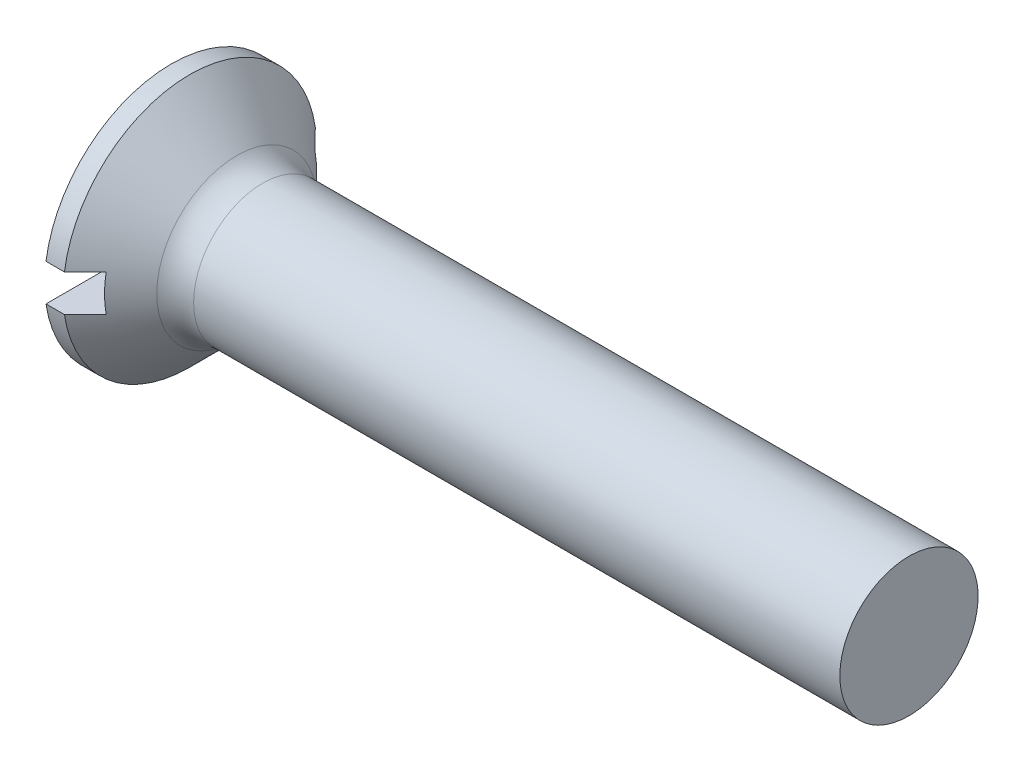
ISO-10303-21;
HEADER;
FILE_DESCRIPTION(('STEP AP214'),'2;1');
FILE_NAME('part.step','',(''),(''),'','','');
FILE_SCHEMA(('AUTOMOTIVE_DESIGN { 1 0 10303 214 1 1 1 1 }'));
ENDSEC;
DATA;
#1=APPLICATION_CONTEXT('core data for automotive mechanical design processes');
#2=APPLICATION_PROTOCOL_DEFINITION('international standard','automotive_design',2000,#1);
#3=PRODUCT_CONTEXT('',#1,'mechanical');
#4=PRODUCT('Part','Part','',(#3));
#5=PRODUCT_RELATED_PRODUCT_CATEGORY('part','',(#4));
#6=PRODUCT_DEFINITION_FORMATION('','',#4);
#7=PRODUCT_DEFINITION_CONTEXT('part definition',#1,'design');
#8=PRODUCT_DEFINITION('design','',#6,#7);
#9=PRODUCT_DEFINITION_SHAPE('','',#8);
#10=(LENGTH_UNIT() NAMED_UNIT(*) SI_UNIT(.MILLI.,.METRE.));
#11=(NAMED_UNIT(*) PLANE_ANGLE_UNIT() SI_UNIT($,.RADIAN.));
#12=(NAMED_UNIT(*) SI_UNIT($,.STERADIAN.) SOLID_ANGLE_UNIT());
#13=UNCERTAINTY_MEASURE_WITH_UNIT(LENGTH_MEASURE(1.E-05),#10,'distance_accuracy_value','');
#14=(GEOMETRIC_REPRESENTATION_CONTEXT(3) GLOBAL_UNCERTAINTY_ASSIGNED_CONTEXT((#13)) GLOBAL_UNIT_ASSIGNED_CONTEXT((#10,
#11,#12)) REPRESENTATION_CONTEXT('',''));
#15=CARTESIAN_POINT('',(0.,0.,0.));
#16=DIRECTION('',(0.,0.,1.));
#17=DIRECTION('',(1.,0.,0.));
#18=AXIS2_PLACEMENT_3D('',#15,#16,#17);
#19=CARTESIAN_POINT('',(0.85,0.4,-2.75));
#20=DIRECTION('',(-1.,0.,0.));
#21=DIRECTION('',(0.,0.,1.));
#22=AXIS2_PLACEMENT_3D('',#19,#20,#21);
#23=PLANE('',#22);
#24=DIRECTION('',(0.,0.,1.));
#25=VECTOR('',#24,1.);
#26=CARTESIAN_POINT('',(0.85,0.4,2.75));
#27=LINE('',#26,#25);
#28=CARTESIAN_POINT('',(0.850000000034848,0.4,2.26495033058316));
#29=VERTEX_POINT('',#28);
#30=CARTESIAN_POINT('',(0.850000000022832,0.4,-2.26495033059536));
#31=VERTEX_POINT('',#30);
#32=EDGE_CURVE('E74',#29,#31,#27,.F.);
#33=ORIENTED_EDGE('',*,*,#32,.T.);
#34=CARTESIAN_POINT('',(0.850000000045666,0.,0.));
#35=DIRECTION('',(-1.,0.,0.));
#36=DIRECTION('',(0.,0.,1.));
#37=AXIS2_PLACEMENT_3D('',#34,#35,#36);
#38=CIRCLE('',#37,2.29999999999109);
#39=CARTESIAN_POINT('',(0.850000000034848,-0.400000000000001,-2.26495033058316));
#40=VERTEX_POINT('',#39);
#41=EDGE_CURVE('E83',#31,#40,#38,.T.);
#42=ORIENTED_EDGE('',*,*,#41,.T.);
#43=DIRECTION('',(0.,0.,-1.));
#44=VECTOR('',#43,1.);
#45=CARTESIAN_POINT('',(0.85,-0.400000000000001,-2.75));
#46=LINE('',#45,#44);
#47=CARTESIAN_POINT('',(0.850000000022832,-0.400000000000001,2.26495033059536));
#48=VERTEX_POINT('',#47);
#49=EDGE_CURVE('E81',#40,#48,#46,.F.);
#50=ORIENTED_EDGE('',*,*,#49,.T.);
#51=CARTESIAN_POINT('',(0.850000000045665,0.,0.));
#52=DIRECTION('',(-1.,0.,0.));
#53=DIRECTION('',(0.,0.,1.));
#54=AXIS2_PLACEMENT_3D('',#51,#52,#53);
#55=CIRCLE('',#54,2.29999999999109);
#56=EDGE_CURVE('E19',#48,#29,#55,.T.);
#57=ORIENTED_EDGE('',*,*,#56,.T.);
#58=EDGE_LOOP('',(#33,#42,#50,#57));
#59=FACE_BOUND('',#58,.T.);
#60=ADVANCED_FACE('F16',(#59),#23,.T.);
#61=CARTESIAN_POINT('',(0.85,-0.400000000000001,-2.75));
#62=DIRECTION('',(0.,-1.,0.));
#63=DIRECTION('',(0.,0.,-1.));
#64=AXIS2_PLACEMENT_3D('',#61,#62,#63);
#65=PLANE('',#64);
#66=CARTESIAN_POINT('',(0.850000000024471,-0.400000000000001,2.2649503305937));
#67=CARTESIAN_POINT('',(0.775087851769284,-0.400000000000001,2.34100427520676));
#68=CARTESIAN_POINT('',(0.700131776523776,-0.400000000000001,2.41701485210356));
#69=CARTESIAN_POINT('',(0.550131776521702,-0.400000000000001,2.56894926593744));
#70=CARTESIAN_POINT('',(0.475087851770372,-0.400000000000001,2.64487310287968));
#71=CARTESIAN_POINT('',(0.400000000033956,-0.400000000000001,2.72075357211084));
#72=B_SPLINE_CURVE_WITH_KNOTS('',3,(#66,#67,#68,#69,#70,#71),.UNSPECIFIED.,.F.,.F.,(4,2,4),(0.,
0.320256442788528,0.64051286649153),.UNSPECIFIED.);
#73=CARTESIAN_POINT('',(0.400000000023617,-0.400000000000001,2.7207535720967));
#74=VERTEX_POINT('',#73);
#75=EDGE_CURVE('E98',#48,#74,#72,.T.);
#76=ORIENTED_EDGE('',*,*,#75,.F.);
#77=ORIENTED_EDGE('',*,*,#49,.F.);
#78=CARTESIAN_POINT('',(0.400000000033956,-0.400000000000001,-2.72075357211084));
#79=CARTESIAN_POINT('',(0.475087851770298,-0.400000000000001,-2.64487310287976));
#80=CARTESIAN_POINT('',(0.550131776521555,-0.400000000000001,-2.56894926593759));
#81=CARTESIAN_POINT('',(0.700131776523482,-0.400000000000001,-2.41701485210386));
#82=CARTESIAN_POINT('',(0.775087851768918,-0.400000000000001,-2.34100427520713));
#83=CARTESIAN_POINT('',(0.850000000024031,-0.400000000000001,-2.26495033059414));
#84=B_SPLINE_CURVE_WITH_KNOTS('',3,(#78,#79,#80,#81,#82,#83),.UNSPECIFIED.,.F.,.F.,(4,2,4),(0.,
0.320256423702689,0.640512866490904),.UNSPECIFIED.);
#85=CARTESIAN_POINT('',(0.400000000037608,-0.400000000000001,-2.72075357207842));
#86=VERTEX_POINT('',#85);
#87=EDGE_CURVE('E99',#86,#40,#84,.T.);
#88=ORIENTED_EDGE('',*,*,#87,.F.);
#89=DIRECTION('',(1.,0.,0.));
#90=VECTOR('',#89,1.);
#91=CARTESIAN_POINT('',(0.85,-0.400000000000001,-2.72075357208256));
#92=LINE('',#91,#90);
#93=CARTESIAN_POINT('',(0.,-0.400000000000001,-2.72075357208256));
#94=VERTEX_POINT('',#93);
#95=EDGE_CURVE('E137',#94,#86,#92,.T.);
#96=ORIENTED_EDGE('',*,*,#95,.F.);
#97=DIRECTION('',(0.,0.,1.));
#98=VECTOR('',#97,1.);
#99=CARTESIAN_POINT('',(0.,-0.400000000000001,0.));
#100=LINE('',#99,#98);
#101=CARTESIAN_POINT('',(0.,-0.400000000000001,2.72075357208256));
#102=VERTEX_POINT('',#101);
#103=EDGE_CURVE('E165',#102,#94,#100,.F.);
#104=ORIENTED_EDGE('',*,*,#103,.F.);
#105=DIRECTION('',(1.,0.,0.));
#106=VECTOR('',#105,1.);
#107=CARTESIAN_POINT('',(0.85,-0.400000000000001,2.72075357208256));
#108=LINE('',#107,#106);
#109=EDGE_CURVE('E170',#74,#102,#108,.F.);
#110=ORIENTED_EDGE('',*,*,#109,.F.);
#111=EDGE_LOOP('',(#76,#77,#88,#96,#104,#110));
#112=FACE_BOUND('',#111,.T.);
#113=ADVANCED_FACE('F138',(#112),#65,.F.);
#114=CARTESIAN_POINT('',(0.85,0.4,2.75));
#115=DIRECTION('',(0.,1.,0.));
#116=DIRECTION('',(0.,0.,1.));
#117=AXIS2_PLACEMENT_3D('',#114,#115,#116);
#118=PLANE('',#117);
#119=CARTESIAN_POINT('',(0.85000000002447,0.4,-2.2649503305937));
#120=CARTESIAN_POINT('',(0.775087851769284,0.4,-2.34100427520676));
#121=CARTESIAN_POINT('',(0.700131776523775,0.4,-2.41701485210356));
#122=CARTESIAN_POINT('',(0.550131776521701,0.4,-2.56894926593744));
#123=CARTESIAN_POINT('',(0.475087851770372,0.4,-2.64487310287968));
#124=CARTESIAN_POINT('',(0.400000000033956,0.4,-2.72075357211084));
#125=B_SPLINE_CURVE_WITH_KNOTS('',3,(#119,#120,#121,#122,#123,#124),.UNSPECIFIED.,.F.,.F.,(4,2,
4),(0.,0.320256442788528,0.64051286649153),.UNSPECIFIED.);
#126=CARTESIAN_POINT('',(0.400000000023617,0.4,-2.7207535720967));
#127=VERTEX_POINT('',#126);
#128=EDGE_CURVE('E86',#31,#127,#125,.T.);
#129=ORIENTED_EDGE('',*,*,#128,.F.);
#130=ORIENTED_EDGE('',*,*,#32,.F.);
#131=CARTESIAN_POINT('',(0.400000000033956,0.4,2.72075357211084));
#132=CARTESIAN_POINT('',(0.475087851770298,0.4,2.64487310287976));
#133=CARTESIAN_POINT('',(0.550131776521554,0.4,2.56894926593759));
#134=CARTESIAN_POINT('',(0.700131776523482,0.4,2.41701485210386));
#135=CARTESIAN_POINT('',(0.775087851768918,0.4,2.34100427520713));
#136=CARTESIAN_POINT('',(0.850000000024031,0.4,2.26495033059414));
#137=B_SPLINE_CURVE_WITH_KNOTS('',3,(#131,#132,#133,#134,#135,#136),.UNSPECIFIED.,.F.,.F.,(4,2,
4),(0.,0.320256423702689,0.640512866490904),.UNSPECIFIED.);
#138=CARTESIAN_POINT('',(0.400000000037608,0.4,2.72075357207842));
#139=VERTEX_POINT('',#138);
#140=EDGE_CURVE('E66',#139,#29,#137,.T.);
#141=ORIENTED_EDGE('',*,*,#140,.F.);
#142=DIRECTION('',(1.,0.,0.));
#143=VECTOR('',#142,1.);
#144=CARTESIAN_POINT('',(0.85,0.4,2.72075357208256));
#145=LINE('',#144,#143);
#146=CARTESIAN_POINT('',(0.,0.4,2.72075357208256));
#147=VERTEX_POINT('',#146);
#148=EDGE_CURVE('E34',#147,#139,#145,.T.);
#149=ORIENTED_EDGE('',*,*,#148,.F.);
#150=DIRECTION('',(0.,0.,1.));
#151=VECTOR('',#150,1.);
#152=CARTESIAN_POINT('',(0.,0.4,0.));
#153=LINE('',#152,#151);
#154=CARTESIAN_POINT('',(0.,0.4,-2.72075357208256));
#155=VERTEX_POINT('',#154);
#156=EDGE_CURVE('E107',#155,#147,#153,.T.);
#157=ORIENTED_EDGE('',*,*,#156,.F.);
#158=DIRECTION('',(1.,0.,0.));
#159=VECTOR('',#158,1.);
#160=CARTESIAN_POINT('',(0.85,0.4,-2.72075357208256));
#161=LINE('',#160,#159);
#162=EDGE_CURVE('E88',#127,#155,#161,.F.);
#163=ORIENTED_EDGE('',*,*,#162,.F.);
#164=EDGE_LOOP('',(#129,#130,#141,#149,#157,#163));
#165=FACE_BOUND('',#164,.T.);
#166=ADVANCED_FACE('F84',(#165),#118,.F.);
#167=CARTESIAN_POINT('',(0.,0.,0.));
#168=DIRECTION('',(-1.,0.,0.));
#169=DIRECTION('',(0.,0.,1.));
#170=AXIS2_PLACEMENT_3D('',#167,#168,#169);
#171=PLANE('',#170);
#172=ORIENTED_EDGE('',*,*,#103,.T.);
#173=CARTESIAN_POINT('',(0.,0.,0.));
#174=DIRECTION('',(-1.,0.,0.));
#175=DIRECTION('',(0.,0.,1.));
#176=AXIS2_PLACEMENT_3D('',#173,#174,#175);
#177=CIRCLE('',#176,2.75);
#178=EDGE_CURVE('E105',#102,#94,#177,.F.);
#179=ORIENTED_EDGE('',*,*,#178,.F.);
#180=EDGE_LOOP('',(#172,#179));
#181=FACE_BOUND('',#180,.T.);
#182=ADVANCED_FACE('F148',(#181),#171,.T.);
#183=CARTESIAN_POINT('',(0.,0.,0.));
#184=DIRECTION('',(-1.,0.,0.));
#185=DIRECTION('',(0.,0.,1.));
#186=AXIS2_PLACEMENT_3D('',#183,#184,#185);
#187=PLANE('',#186);
#188=ORIENTED_EDGE('',*,*,#156,.T.);
#189=CARTESIAN_POINT('',(0.,0.,0.));
#190=DIRECTION('',(-1.,0.,0.));
#191=DIRECTION('',(0.,0.,1.));
#192=AXIS2_PLACEMENT_3D('',#189,#190,#191);
#193=CIRCLE('',#192,2.75);
#194=EDGE_CURVE('E96',#155,#147,#193,.F.);
#195=ORIENTED_EDGE('',*,*,#194,.F.);
#196=EDGE_LOOP('',(#188,#195));
#197=FACE_BOUND('',#196,.T.);
#198=ADVANCED_FACE('F180',(#197),#187,.T.);
#199=CARTESIAN_POINT('',(-6.34999999999999,0.,0.));
#200=DIRECTION('',(-1.,0.,0.));
#201=DIRECTION('',(0.,0.,1.));
#202=AXIS2_PLACEMENT_3D('',#199,#200,#201);
#203=CYLINDRICAL_SURFACE('',#202,2.75);
#204=ORIENTED_EDGE('',*,*,#95,.T.);
#205=CARTESIAN_POINT('',(0.400000000013279,0.,0.));
#206=DIRECTION('',(-1.,0.,0.));
#207=DIRECTION('',(0.,0.,1.));
#208=AXIS2_PLACEMENT_3D('',#205,#206,#207);
#209=CIRCLE('',#208,2.74999999999181);
#210=EDGE_CURVE('E93',#74,#86,#209,.F.);
#211=ORIENTED_EDGE('',*,*,#210,.F.);
#212=ORIENTED_EDGE('',*,*,#109,.T.);
#213=ORIENTED_EDGE('',*,*,#178,.T.);
#214=EDGE_LOOP('',(#204,#211,#212,#213));
#215=FACE_BOUND('',#214,.T.);
#216=ADVANCED_FACE('F176',(#215),#203,.T.);
#217=CARTESIAN_POINT('',(-6.34999999999999,0.,0.));
#218=DIRECTION('',(-1.,0.,0.));
#219=DIRECTION('',(0.,0.,1.));
#220=AXIS2_PLACEMENT_3D('',#217,#218,#219);
#221=CYLINDRICAL_SURFACE('',#220,2.75);
#222=ORIENTED_EDGE('',*,*,#148,.T.);
#223=CARTESIAN_POINT('',(0.400000000013279,0.,0.));
#224=DIRECTION('',(-1.,0.,0.));
#225=DIRECTION('',(0.,0.,1.));
#226=AXIS2_PLACEMENT_3D('',#223,#224,#225);
#227=CIRCLE('',#226,2.74999999999181);
#228=EDGE_CURVE('E72',#127,#139,#227,.F.);
#229=ORIENTED_EDGE('',*,*,#228,.F.);
#230=ORIENTED_EDGE('',*,*,#162,.T.);
#231=ORIENTED_EDGE('',*,*,#194,.T.);
#232=EDGE_LOOP('',(#222,#229,#230,#231));
#233=FACE_BOUND('',#232,.T.);
#234=ADVANCED_FACE('F124',(#233),#221,.T.);
#235=CARTESIAN_POINT('',(0.399999999956435,0.,0.));
#236=DIRECTION('',(-1.,0.,0.));
#237=DIRECTION('',(0.,0.,1.));
#238=AXIS2_PLACEMENT_3D('',#235,#236,#237);
#239=CONICAL_SURFACE('',#238,2.7500000001055,0.785398163425431);
#240=ORIENTED_EDGE('',*,*,#41,.F.);
#241=ORIENTED_EDGE('',*,*,#128,.T.);
#242=ORIENTED_EDGE('',*,*,#228,.T.);
#243=ORIENTED_EDGE('',*,*,#140,.T.);
#244=ORIENTED_EDGE('',*,*,#56,.F.);
#245=ORIENTED_EDGE('',*,*,#75,.T.);
#246=ORIENTED_EDGE('',*,*,#210,.T.);
#247=ORIENTED_EDGE('',*,*,#87,.T.);
#248=EDGE_LOOP('',(#240,#241,#242,#243,#244,#245,#246,#247));
#249=FACE_BOUND('',#248,.T.);
#250=CARTESIAN_POINT('',(1.41568542494924,0.,0.));
#251=DIRECTION('',(-1.,0.,0.));
#252=DIRECTION('',(0.,0.,1.));
#253=AXIS2_PLACEMENT_3D('',#250,#251,#252);
#254=CIRCLE('',#253,1.73431457505076);
#255=CARTESIAN_POINT('',(1.41568542494924,0.,1.73431457505076));
#256=VERTEX_POINT('',#255);
#257=EDGE_CURVE('E102',#256,#256,#254,.T.);
#258=ORIENTED_EDGE('',*,*,#257,.T.);
#259=EDGE_LOOP('',(#258));
#260=FACE_BOUND('',#259,.T.);
#261=ADVANCED_FACE('F68',(#249,#260),#239,.T.);
#262=CARTESIAN_POINT('',(16.,1.5,0.));
#263=DIRECTION('',(1.,0.,0.));
#264=DIRECTION('',(0.,0.,-1.));
#265=AXIS2_PLACEMENT_3D('',#262,#263,#264);
#266=PLANE('',#265);
#267=CARTESIAN_POINT('',(16.,0.,0.));
#268=DIRECTION('',(-1.,0.,0.));
#269=DIRECTION('',(0.,0.,1.));
#270=AXIS2_PLACEMENT_3D('',#267,#268,#269);
#271=CIRCLE('',#270,1.5);
#272=CARTESIAN_POINT('',(16.,0.,1.5));
#273=VERTEX_POINT('',#272);
#274=EDGE_CURVE('E25',#273,#273,#271,.T.);
#275=ORIENTED_EDGE('',*,*,#274,.F.);
#276=EDGE_LOOP('',(#275));
#277=FACE_BOUND('',#276,.T.);
#278=ADVANCED_FACE('F123',(#277),#266,.T.);
#279=CARTESIAN_POINT('',(1.98137084989848,0.,0.));
#280=DIRECTION('',(-1.,0.,0.));
#281=DIRECTION('',(0.,0.,1.));
#282=AXIS2_PLACEMENT_3D('',#279,#280,#281);
#283=TOROIDAL_SURFACE('',#282,2.3,0.8);
#284=ORIENTED_EDGE('',*,*,#257,.F.);
#285=EDGE_LOOP('',(#284));
#286=FACE_BOUND('',#285,.T.);
#287=CARTESIAN_POINT('',(1.98137084989848,0.,0.));
#288=DIRECTION('',(-1.,0.,0.));
#289=DIRECTION('',(0.,0.,1.));
#290=AXIS2_PLACEMENT_3D('',#287,#288,#289);
#291=CIRCLE('',#290,1.5);
#292=CARTESIAN_POINT('',(1.98137084989848,0.,1.5));
#293=VERTEX_POINT('',#292);
#294=EDGE_CURVE('E11',#293,#293,#291,.F.);
#295=ORIENTED_EDGE('',*,*,#294,.F.);
#296=EDGE_LOOP('',(#295));
#297=FACE_BOUND('',#296,.T.);
#298=ADVANCED_FACE('F151',(#286,#297),#283,.F.);
#299=CARTESIAN_POINT('',(-6.34999999999999,0.,0.));
#300=DIRECTION('',(-1.,0.,0.));
#301=DIRECTION('',(0.,0.,1.));
#302=AXIS2_PLACEMENT_3D('',#299,#300,#301);
#303=CYLINDRICAL_SURFACE('',#302,1.5);
#304=ORIENTED_EDGE('',*,*,#294,.T.);
#305=EDGE_LOOP('',(#304));
#306=FACE_BOUND('',#305,.T.);
#307=ORIENTED_EDGE('',*,*,#274,.T.);
#308=EDGE_LOOP('',(#307));
#309=FACE_BOUND('',#308,.T.);
#310=ADVANCED_FACE('F149',(#306,#309),#303,.T.);
#311=CLOSED_SHELL('',(#60,#113,#166,#182,#198,#216,#234,#261,#278,#298,#310));
#312=MANIFOLD_SOLID_BREP('B1',#311);
#313=ADVANCED_BREP_SHAPE_REPRESENTATION('',(#18,#312),#14);
#314=SHAPE_DEFINITION_REPRESENTATION(#9,#313);
ENDSEC;
END-ISO-10303-21;
